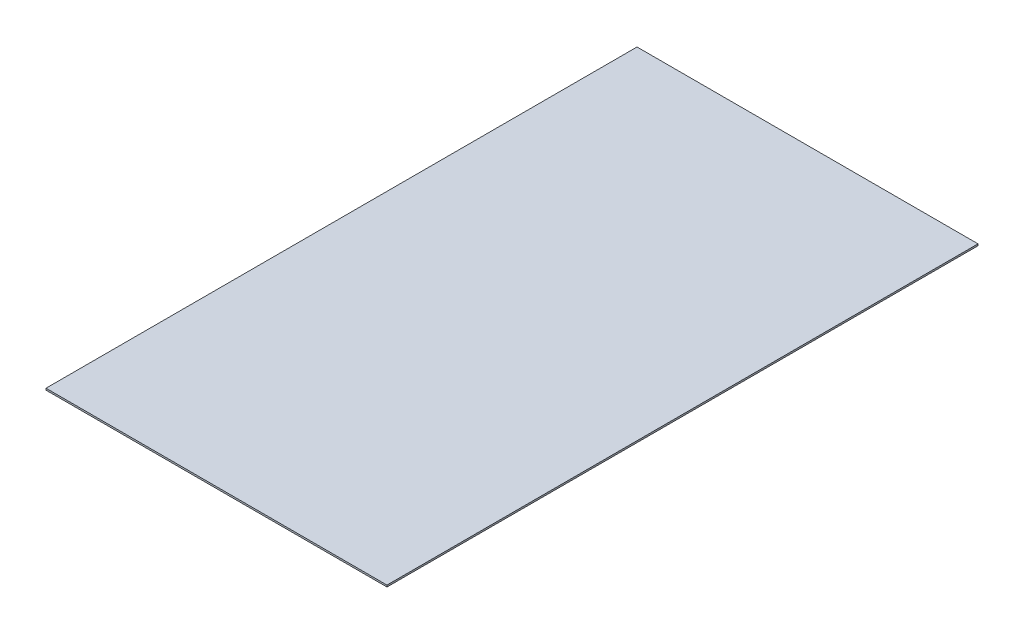
ISO-10303-21;
HEADER;
FILE_DESCRIPTION(('STEP AP214'),'2;1');
FILE_NAME('part.step','',(''),(''),'','','');
FILE_SCHEMA(('AUTOMOTIVE_DESIGN { 1 0 10303 214 1 1 1 1 }'));
ENDSEC;
DATA;
#1=APPLICATION_CONTEXT('core data for automotive mechanical design processes');
#2=APPLICATION_PROTOCOL_DEFINITION('international standard','automotive_design',2000,#1);
#3=PRODUCT_CONTEXT('',#1,'mechanical');
#4=PRODUCT('Part','Part','',(#3));
#5=PRODUCT_RELATED_PRODUCT_CATEGORY('part','',(#4));
#6=PRODUCT_DEFINITION_FORMATION('','',#4);
#7=PRODUCT_DEFINITION_CONTEXT('part definition',#1,'design');
#8=PRODUCT_DEFINITION('design','',#6,#7);
#9=PRODUCT_DEFINITION_SHAPE('','',#8);
#10=(LENGTH_UNIT() NAMED_UNIT(*) SI_UNIT(.MILLI.,.METRE.));
#11=(NAMED_UNIT(*) PLANE_ANGLE_UNIT() SI_UNIT($,.RADIAN.));
#12=(NAMED_UNIT(*) SI_UNIT($,.STERADIAN.) SOLID_ANGLE_UNIT());
#13=UNCERTAINTY_MEASURE_WITH_UNIT(LENGTH_MEASURE(1.E-05),#10,'distance_accuracy_value','');
#14=(GEOMETRIC_REPRESENTATION_CONTEXT(3) GLOBAL_UNCERTAINTY_ASSIGNED_CONTEXT((#13)) GLOBAL_UNIT_ASSIGNED_CONTEXT((#10,
#11,#12)) REPRESENTATION_CONTEXT('',''));
#15=CARTESIAN_POINT('',(0.,0.,0.));
#16=DIRECTION('',(0.,0.,1.));
#17=DIRECTION('',(1.,0.,0.));
#18=AXIS2_PLACEMENT_3D('',#15,#16,#17);
#19=CARTESIAN_POINT('',(150.,1.5,0.));
#20=DIRECTION('',(-1.,0.,0.));
#21=DIRECTION('',(0.,0.,1.));
#22=AXIS2_PLACEMENT_3D('',#19,#20,#21);
#23=PLANE('',#22);
#24=DIRECTION('',(0.,0.,-1.));
#25=VECTOR('',#24,1.);
#26=CARTESIAN_POINT('',(150.,0.,0.));
#27=LINE('',#26,#25);
#28=CARTESIAN_POINT('',(150.,0.,0.));
#29=VERTEX_POINT('',#28);
#30=CARTESIAN_POINT('',(150.,0.,-520.));
#31=VERTEX_POINT('',#30);
#32=EDGE_CURVE('E100',#29,#31,#27,.T.);
#33=ORIENTED_EDGE('',*,*,#32,.T.);
#34=DIRECTION('',(0.,-1.,0.));
#35=VECTOR('',#34,1.);
#36=CARTESIAN_POINT('',(150.,1.5,-520.));
#37=LINE('',#36,#35);
#38=CARTESIAN_POINT('',(150.,1.5,-520.));
#39=VERTEX_POINT('',#38);
#40=EDGE_CURVE('E11',#39,#31,#37,.T.);
#41=ORIENTED_EDGE('',*,*,#40,.F.);
#42=DIRECTION('',(0.,0.,-1.));
#43=VECTOR('',#42,1.);
#44=CARTESIAN_POINT('',(150.,1.5,0.));
#45=LINE('',#44,#43);
#46=CARTESIAN_POINT('',(150.,1.5,0.));
#47=VERTEX_POINT('',#46);
#48=EDGE_CURVE('E88',#47,#39,#45,.T.);
#49=ORIENTED_EDGE('',*,*,#48,.F.);
#50=DIRECTION('',(0.,-1.,0.));
#51=VECTOR('',#50,1.);
#52=CARTESIAN_POINT('',(150.,1.5,0.));
#53=LINE('',#52,#51);
#54=EDGE_CURVE('E96',#47,#29,#53,.T.);
#55=ORIENTED_EDGE('',*,*,#54,.T.);
#56=EDGE_LOOP('',(#33,#41,#49,#55));
#57=FACE_BOUND('',#56,.T.);
#58=ADVANCED_FACE('F37',(#57),#23,.F.);
#59=CARTESIAN_POINT('',(150.,1.5,-520.));
#60=DIRECTION('',(0.,0.,1.));
#61=DIRECTION('',(1.,0.,0.));
#62=AXIS2_PLACEMENT_3D('',#59,#60,#61);
#63=PLANE('',#62);
#64=DIRECTION('',(-1.,0.,0.));
#65=VECTOR('',#64,1.);
#66=CARTESIAN_POINT('',(150.,0.,-520.));
#67=LINE('',#66,#65);
#68=CARTESIAN_POINT('',(-150.,0.,-520.));
#69=VERTEX_POINT('',#68);
#70=EDGE_CURVE('E92',#31,#69,#67,.T.);
#71=ORIENTED_EDGE('',*,*,#70,.T.);
#72=DIRECTION('',(0.,-1.,0.));
#73=VECTOR('',#72,1.);
#74=CARTESIAN_POINT('',(-150.,1.5,-520.));
#75=LINE('',#74,#73);
#76=CARTESIAN_POINT('',(-150.,1.5,-520.));
#77=VERTEX_POINT('',#76);
#78=EDGE_CURVE('E45',#77,#69,#75,.T.);
#79=ORIENTED_EDGE('',*,*,#78,.F.);
#80=DIRECTION('',(-1.,0.,0.));
#81=VECTOR('',#80,1.);
#82=CARTESIAN_POINT('',(150.,1.5,-520.));
#83=LINE('',#82,#81);
#84=EDGE_CURVE('E83',#39,#77,#83,.T.);
#85=ORIENTED_EDGE('',*,*,#84,.F.);
#86=ORIENTED_EDGE('',*,*,#40,.T.);
#87=EDGE_LOOP('',(#71,#79,#85,#86));
#88=FACE_BOUND('',#87,.T.);
#89=ADVANCED_FACE('F91',(#88),#63,.F.);
#90=CARTESIAN_POINT('',(-150.,1.5,0.));
#91=DIRECTION('',(1.,0.,0.));
#92=DIRECTION('',(0.,0.,-1.));
#93=AXIS2_PLACEMENT_3D('',#90,#91,#92);
#94=PLANE('',#93);
#95=DIRECTION('',(0.,0.,1.));
#96=VECTOR('',#95,1.);
#97=CARTESIAN_POINT('',(-150.,0.,0.));
#98=LINE('',#97,#96);
#99=CARTESIAN_POINT('',(-150.,0.,0.));
#100=VERTEX_POINT('',#99);
#101=EDGE_CURVE('E70',#69,#100,#98,.T.);
#102=ORIENTED_EDGE('',*,*,#101,.T.);
#103=DIRECTION('',(0.,-1.,0.));
#104=VECTOR('',#103,1.);
#105=CARTESIAN_POINT('',(-150.,1.5,0.));
#106=LINE('',#105,#104);
#107=CARTESIAN_POINT('',(-150.,1.5,0.));
#108=VERTEX_POINT('',#107);
#109=EDGE_CURVE('E93',#108,#100,#106,.T.);
#110=ORIENTED_EDGE('',*,*,#109,.F.);
#111=DIRECTION('',(0.,0.,1.));
#112=VECTOR('',#111,1.);
#113=CARTESIAN_POINT('',(-150.,1.5,0.));
#114=LINE('',#113,#112);
#115=EDGE_CURVE('E86',#77,#108,#114,.T.);
#116=ORIENTED_EDGE('',*,*,#115,.F.);
#117=ORIENTED_EDGE('',*,*,#78,.T.);
#118=EDGE_LOOP('',(#102,#110,#116,#117));
#119=FACE_BOUND('',#118,.T.);
#120=ADVANCED_FACE('F94',(#119),#94,.F.);
#121=CARTESIAN_POINT('',(150.,1.5,0.));
#122=DIRECTION('',(0.,0.,-1.));
#123=DIRECTION('',(-1.,0.,0.));
#124=AXIS2_PLACEMENT_3D('',#121,#122,#123);
#125=PLANE('',#124);
#126=DIRECTION('',(1.,0.,0.));
#127=VECTOR('',#126,1.);
#128=CARTESIAN_POINT('',(150.,0.,0.));
#129=LINE('',#128,#127);
#130=EDGE_CURVE('E76',#100,#29,#129,.T.);
#131=ORIENTED_EDGE('',*,*,#130,.T.);
#132=ORIENTED_EDGE('',*,*,#54,.F.);
#133=DIRECTION('',(1.,0.,0.));
#134=VECTOR('',#133,1.);
#135=CARTESIAN_POINT('',(150.,1.5,0.));
#136=LINE('',#135,#134);
#137=EDGE_CURVE('E53',#108,#47,#136,.T.);
#138=ORIENTED_EDGE('',*,*,#137,.F.);
#139=ORIENTED_EDGE('',*,*,#109,.T.);
#140=EDGE_LOOP('',(#131,#132,#138,#139));
#141=FACE_BOUND('',#140,.T.);
#142=ADVANCED_FACE('F107',(#141),#125,.F.);
#143=CARTESIAN_POINT('',(0.,1.5,0.));
#144=DIRECTION('',(0.,1.,0.));
#145=DIRECTION('',(0.,0.,1.));
#146=AXIS2_PLACEMENT_3D('',#143,#144,#145);
#147=PLANE('',#146);
#148=ORIENTED_EDGE('',*,*,#48,.T.);
#149=ORIENTED_EDGE('',*,*,#84,.T.);
#150=ORIENTED_EDGE('',*,*,#115,.T.);
#151=ORIENTED_EDGE('',*,*,#137,.T.);
#152=EDGE_LOOP('',(#148,#149,#150,#151));
#153=FACE_BOUND('',#152,.T.);
#154=ADVANCED_FACE('F84',(#153),#147,.T.);
#155=CARTESIAN_POINT('',(0.,0.,0.));
#156=DIRECTION('',(0.,1.,0.));
#157=DIRECTION('',(0.,0.,1.));
#158=AXIS2_PLACEMENT_3D('',#155,#156,#157);
#159=PLANE('',#158);
#160=ORIENTED_EDGE('',*,*,#32,.F.);
#161=ORIENTED_EDGE('',*,*,#130,.F.);
#162=ORIENTED_EDGE('',*,*,#101,.F.);
#163=ORIENTED_EDGE('',*,*,#70,.F.);
#164=EDGE_LOOP('',(#160,#161,#162,#163));
#165=FACE_BOUND('',#164,.T.);
#166=ADVANCED_FACE('F110',(#165),#159,.F.);
#167=CLOSED_SHELL('',(#58,#89,#120,#142,#154,#166));
#168=MANIFOLD_SOLID_BREP('B2',#167);
#169=ADVANCED_BREP_SHAPE_REPRESENTATION('',(#18,#168),#14);
#170=SHAPE_DEFINITION_REPRESENTATION(#9,#169);
ENDSEC;
END-ISO-10303-21;
